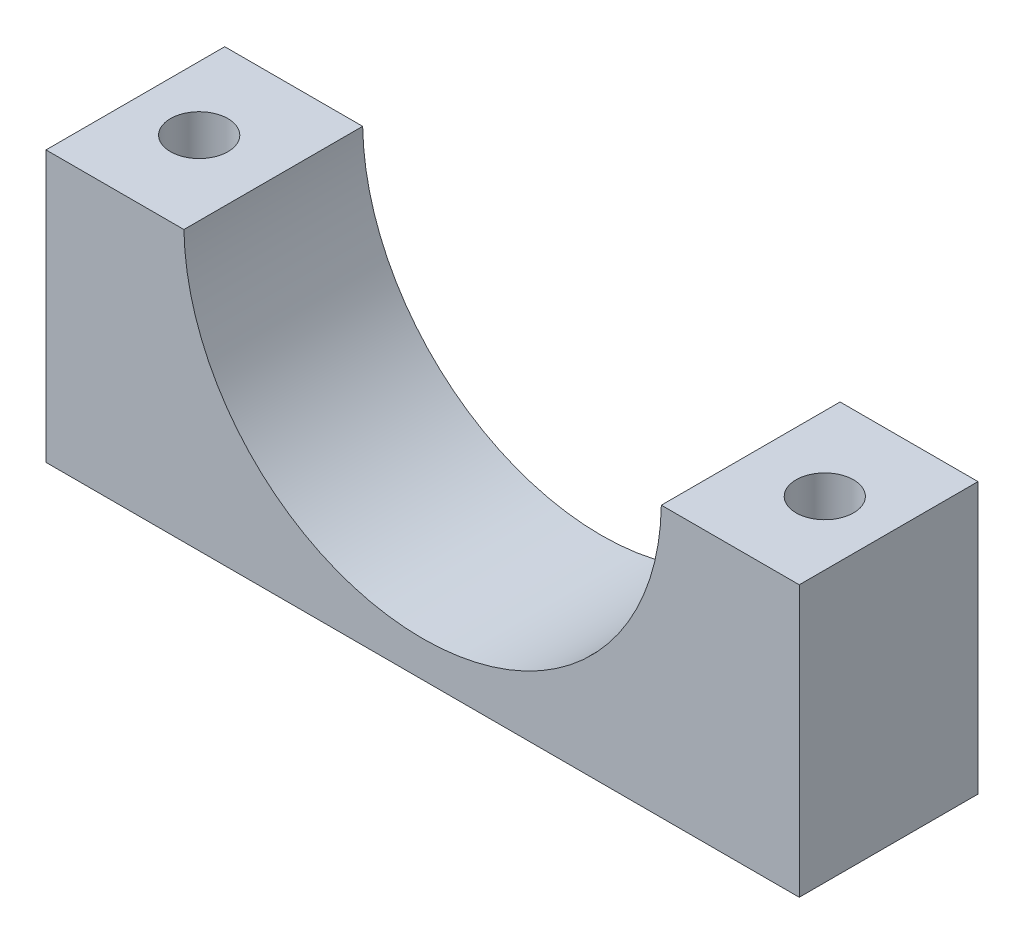
ISO-10303-21;
HEADER;
FILE_DESCRIPTION(('STEP AP214'),'2;1');
FILE_NAME('part.step','',(''),(''),'','','');
FILE_SCHEMA(('AUTOMOTIVE_DESIGN { 1 0 10303 214 1 1 1 1 }'));
ENDSEC;
DATA;
#1=APPLICATION_CONTEXT('core data for automotive mechanical design processes');
#2=APPLICATION_PROTOCOL_DEFINITION('international standard','automotive_design',2000,#1);
#3=PRODUCT_CONTEXT('',#1,'mechanical');
#4=PRODUCT('Part','Part','',(#3));
#5=PRODUCT_RELATED_PRODUCT_CATEGORY('part','',(#4));
#6=PRODUCT_DEFINITION_FORMATION('','',#4);
#7=PRODUCT_DEFINITION_CONTEXT('part definition',#1,'design');
#8=PRODUCT_DEFINITION('design','',#6,#7);
#9=PRODUCT_DEFINITION_SHAPE('','',#8);
#10=(LENGTH_UNIT() NAMED_UNIT(*) SI_UNIT(.MILLI.,.METRE.));
#11=(NAMED_UNIT(*) PLANE_ANGLE_UNIT() SI_UNIT($,.RADIAN.));
#12=(NAMED_UNIT(*) SI_UNIT($,.STERADIAN.) SOLID_ANGLE_UNIT());
#13=UNCERTAINTY_MEASURE_WITH_UNIT(LENGTH_MEASURE(1.E-05),#10,'distance_accuracy_value','');
#14=(GEOMETRIC_REPRESENTATION_CONTEXT(3) GLOBAL_UNCERTAINTY_ASSIGNED_CONTEXT((#13)) GLOBAL_UNIT_ASSIGNED_CONTEXT((#10,
#11,#12)) REPRESENTATION_CONTEXT('',''));
#15=CARTESIAN_POINT('',(0.,0.,0.));
#16=DIRECTION('',(0.,0.,1.));
#17=DIRECTION('',(1.,0.,0.));
#18=AXIS2_PLACEMENT_3D('',#15,#16,#17);
#19=CARTESIAN_POINT('',(-29.5,28.2,14.));
#20=DIRECTION('',(1.,0.,0.));
#21=DIRECTION('',(0.,0.,-1.));
#22=AXIS2_PLACEMENT_3D('',#19,#20,#21);
#23=PLANE('',#22);
#24=DIRECTION('',(0.,-1.,0.));
#25=VECTOR('',#24,1.);
#26=CARTESIAN_POINT('',(-29.5,28.2,0.));
#27=LINE('',#26,#25);
#28=CARTESIAN_POINT('',(-29.5,28.2,0.));
#29=VERTEX_POINT('',#28);
#30=CARTESIAN_POINT('',(-29.5,7.,0.));
#31=VERTEX_POINT('',#30);
#32=EDGE_CURVE('E136',#29,#31,#27,.T.);
#33=ORIENTED_EDGE('',*,*,#32,.T.);
#34=DIRECTION('',(0.,0.,-1.));
#35=VECTOR('',#34,1.);
#36=CARTESIAN_POINT('',(-29.5,7.,14.));
#37=LINE('',#36,#35);
#38=CARTESIAN_POINT('',(-29.5,7.,14.));
#39=VERTEX_POINT('',#38);
#40=EDGE_CURVE('E11',#39,#31,#37,.T.);
#41=ORIENTED_EDGE('',*,*,#40,.F.);
#42=DIRECTION('',(0.,-1.,0.));
#43=VECTOR('',#42,1.);
#44=CARTESIAN_POINT('',(-29.5,28.2,14.));
#45=LINE('',#44,#43);
#46=CARTESIAN_POINT('',(-29.5,28.2,14.));
#47=VERTEX_POINT('',#46);
#48=EDGE_CURVE('E152',#47,#39,#45,.T.);
#49=ORIENTED_EDGE('',*,*,#48,.F.);
#50=DIRECTION('',(0.,0.,-1.));
#51=VECTOR('',#50,1.);
#52=CARTESIAN_POINT('',(-29.5,28.2,14.));
#53=LINE('',#52,#51);
#54=EDGE_CURVE('E132',#47,#29,#53,.T.);
#55=ORIENTED_EDGE('',*,*,#54,.T.);
#56=EDGE_LOOP('',(#33,#41,#49,#55));
#57=FACE_BOUND('',#56,.T.);
#58=ADVANCED_FACE('F45',(#57),#23,.F.);
#59=CARTESIAN_POINT('',(-29.5,7.,14.));
#60=DIRECTION('',(0.,1.,0.));
#61=DIRECTION('',(0.,0.,1.));
#62=AXIS2_PLACEMENT_3D('',#59,#60,#61);
#63=PLANE('',#62);
#64=CARTESIAN_POINT('',(-24.5,7.,7.));
#65=DIRECTION('',(0.,1.,0.));
#66=DIRECTION('',(0.,0.,1.));
#67=AXIS2_PLACEMENT_3D('',#64,#65,#66);
#68=CIRCLE('',#67,2.25);
#69=CARTESIAN_POINT('',(-24.5,7.,9.25));
#70=VERTEX_POINT('',#69);
#71=EDGE_CURVE('E203',#70,#70,#68,.F.);
#72=ORIENTED_EDGE('',*,*,#71,.F.);
#73=EDGE_LOOP('',(#72));
#74=FACE_BOUND('',#73,.T.);
#75=CARTESIAN_POINT('',(24.5,7.,7.));
#76=DIRECTION('',(0.,1.,0.));
#77=DIRECTION('',(0.,0.,1.));
#78=AXIS2_PLACEMENT_3D('',#75,#76,#77);
#79=CIRCLE('',#78,2.25);
#80=CARTESIAN_POINT('',(24.5,7.,9.25));
#81=VERTEX_POINT('',#80);
#82=EDGE_CURVE('E141',#81,#81,#79,.F.);
#83=ORIENTED_EDGE('',*,*,#82,.F.);
#84=EDGE_LOOP('',(#83));
#85=FACE_BOUND('',#84,.T.);
#86=DIRECTION('',(1.,0.,0.));
#87=VECTOR('',#86,1.);
#88=CARTESIAN_POINT('',(-29.5,7.,0.));
#89=LINE('',#88,#87);
#90=CARTESIAN_POINT('',(29.5,7.,0.));
#91=VERTEX_POINT('',#90);
#92=EDGE_CURVE('E140',#31,#91,#89,.T.);
#93=ORIENTED_EDGE('',*,*,#92,.T.);
#94=DIRECTION('',(0.,0.,-1.));
#95=VECTOR('',#94,1.);
#96=CARTESIAN_POINT('',(29.5,7.,14.));
#97=LINE('',#96,#95);
#98=CARTESIAN_POINT('',(29.5,7.,14.));
#99=VERTEX_POINT('',#98);
#100=EDGE_CURVE('E54',#99,#91,#97,.T.);
#101=ORIENTED_EDGE('',*,*,#100,.F.);
#102=DIRECTION('',(1.,0.,0.));
#103=VECTOR('',#102,1.);
#104=CARTESIAN_POINT('',(-29.5,7.,14.));
#105=LINE('',#104,#103);
#106=EDGE_CURVE('E99',#39,#99,#105,.T.);
#107=ORIENTED_EDGE('',*,*,#106,.F.);
#108=ORIENTED_EDGE('',*,*,#40,.T.);
#109=EDGE_LOOP('',(#93,#101,#107,#108));
#110=FACE_BOUND('',#109,.T.);
#111=ADVANCED_FACE('F181',(#74,#85,#110),#63,.F.);
#112=CARTESIAN_POINT('',(29.5,7.,14.));
#113=DIRECTION('',(-1.,0.,0.));
#114=DIRECTION('',(0.,0.,1.));
#115=AXIS2_PLACEMENT_3D('',#112,#113,#114);
#116=PLANE('',#115);
#117=DIRECTION('',(0.,1.,0.));
#118=VECTOR('',#117,1.);
#119=CARTESIAN_POINT('',(29.5,7.,0.));
#120=LINE('',#119,#118);
#121=CARTESIAN_POINT('',(29.5,28.2,0.));
#122=VERTEX_POINT('',#121);
#123=EDGE_CURVE('E144',#91,#122,#120,.T.);
#124=ORIENTED_EDGE('',*,*,#123,.T.);
#125=DIRECTION('',(0.,0.,-1.));
#126=VECTOR('',#125,1.);
#127=CARTESIAN_POINT('',(29.5,28.2,14.));
#128=LINE('',#127,#126);
#129=CARTESIAN_POINT('',(29.5,28.2,14.));
#130=VERTEX_POINT('',#129);
#131=EDGE_CURVE('E123',#130,#122,#128,.T.);
#132=ORIENTED_EDGE('',*,*,#131,.F.);
#133=DIRECTION('',(0.,1.,0.));
#134=VECTOR('',#133,1.);
#135=CARTESIAN_POINT('',(29.5,7.,14.));
#136=LINE('',#135,#134);
#137=EDGE_CURVE('E112',#99,#130,#136,.T.);
#138=ORIENTED_EDGE('',*,*,#137,.F.);
#139=ORIENTED_EDGE('',*,*,#100,.T.);
#140=EDGE_LOOP('',(#124,#132,#138,#139));
#141=FACE_BOUND('',#140,.T.);
#142=ADVANCED_FACE('F162',(#141),#116,.F.);
#143=CARTESIAN_POINT('',(29.5,28.2,14.));
#144=DIRECTION('',(0.,-1.,0.));
#145=DIRECTION('',(0.,0.,-1.));
#146=AXIS2_PLACEMENT_3D('',#143,#144,#145);
#147=PLANE('',#146);
#148=CARTESIAN_POINT('',(24.5,28.2,7.));
#149=DIRECTION('',(0.,1.,0.));
#150=DIRECTION('',(0.,0.,1.));
#151=AXIS2_PLACEMENT_3D('',#148,#149,#150);
#152=CIRCLE('',#151,2.25);
#153=CARTESIAN_POINT('',(24.5,28.2,9.25));
#154=VERTEX_POINT('',#153);
#155=EDGE_CURVE('E196',#154,#154,#152,.T.);
#156=ORIENTED_EDGE('',*,*,#155,.F.);
#157=EDGE_LOOP('',(#156));
#158=FACE_BOUND('',#157,.T.);
#159=DIRECTION('',(-1.,0.,0.));
#160=VECTOR('',#159,1.);
#161=CARTESIAN_POINT('',(29.5,28.2,0.));
#162=LINE('',#161,#160);
#163=CARTESIAN_POINT('',(18.697593428,28.2,0.));
#164=VERTEX_POINT('',#163);
#165=EDGE_CURVE('E121',#122,#164,#162,.T.);
#166=ORIENTED_EDGE('',*,*,#165,.T.);
#167=DIRECTION('',(0.,0.,-1.));
#168=VECTOR('',#167,1.);
#169=CARTESIAN_POINT('',(18.697593428,28.2,14.));
#170=LINE('',#169,#168);
#171=CARTESIAN_POINT('',(18.697593428,28.2,14.));
#172=VERTEX_POINT('',#171);
#173=EDGE_CURVE('E118',#172,#164,#170,.T.);
#174=ORIENTED_EDGE('',*,*,#173,.F.);
#175=DIRECTION('',(-1.,0.,0.));
#176=VECTOR('',#175,1.);
#177=CARTESIAN_POINT('',(29.5,28.2,14.));
#178=LINE('',#177,#176);
#179=EDGE_CURVE('E106',#130,#172,#178,.T.);
#180=ORIENTED_EDGE('',*,*,#179,.F.);
#181=ORIENTED_EDGE('',*,*,#131,.T.);
#182=EDGE_LOOP('',(#166,#174,#180,#181));
#183=FACE_BOUND('',#182,.T.);
#184=ADVANCED_FACE('F119',(#158,#183),#147,.F.);
#185=CARTESIAN_POINT('',(0.,28.4999999999671,14.));
#186=DIRECTION('',(0.,0.,-1.));
#187=DIRECTION('',(-1.,0.,0.));
#188=AXIS2_PLACEMENT_3D('',#185,#186,#187);
#189=CYLINDRICAL_SURFACE('',#188,18.6999999999671);
#190=CARTESIAN_POINT('',(0.,28.4999999999671,0.));
#191=DIRECTION('',(0.,0.,-1.));
#192=DIRECTION('',(-1.,0.,0.));
#193=AXIS2_PLACEMENT_3D('',#190,#191,#192);
#194=CIRCLE('',#193,18.6999999999671);
#195=CARTESIAN_POINT('',(-18.697593428,28.2,0.));
#196=VERTEX_POINT('',#195);
#197=EDGE_CURVE('E85',#164,#196,#194,.T.);
#198=ORIENTED_EDGE('',*,*,#197,.T.);
#199=DIRECTION('',(0.,0.,-1.));
#200=VECTOR('',#199,1.);
#201=CARTESIAN_POINT('',(-18.697593428,28.2,14.));
#202=LINE('',#201,#200);
#203=CARTESIAN_POINT('',(-18.697593428,28.2,14.));
#204=VERTEX_POINT('',#203);
#205=EDGE_CURVE('E124',#204,#196,#202,.T.);
#206=ORIENTED_EDGE('',*,*,#205,.F.);
#207=CARTESIAN_POINT('',(0.,28.4999999999671,14.));
#208=DIRECTION('',(0.,0.,-1.));
#209=DIRECTION('',(-1.,0.,0.));
#210=AXIS2_PLACEMENT_3D('',#207,#208,#209);
#211=CIRCLE('',#210,18.6999999999671);
#212=EDGE_CURVE('E110',#172,#204,#211,.T.);
#213=ORIENTED_EDGE('',*,*,#212,.F.);
#214=ORIENTED_EDGE('',*,*,#173,.T.);
#215=EDGE_LOOP('',(#198,#206,#213,#214));
#216=FACE_BOUND('',#215,.T.);
#217=ADVANCED_FACE('F126',(#216),#189,.F.);
#218=CARTESIAN_POINT('',(-18.697593428,28.2,14.));
#219=DIRECTION('',(0.,-1.,0.));
#220=DIRECTION('',(0.,0.,-1.));
#221=AXIS2_PLACEMENT_3D('',#218,#219,#220);
#222=PLANE('',#221);
#223=CARTESIAN_POINT('',(-24.5,28.2,7.));
#224=DIRECTION('',(0.,1.,0.));
#225=DIRECTION('',(0.,0.,1.));
#226=AXIS2_PLACEMENT_3D('',#223,#224,#225);
#227=CIRCLE('',#226,2.25);
#228=CARTESIAN_POINT('',(-24.5,28.2,9.25));
#229=VERTEX_POINT('',#228);
#230=EDGE_CURVE('E199',#229,#229,#227,.T.);
#231=ORIENTED_EDGE('',*,*,#230,.F.);
#232=EDGE_LOOP('',(#231));
#233=FACE_BOUND('',#232,.T.);
#234=DIRECTION('',(-1.,0.,0.));
#235=VECTOR('',#234,1.);
#236=CARTESIAN_POINT('',(-18.697593428,28.2,0.));
#237=LINE('',#236,#235);
#238=EDGE_CURVE('E91',#196,#29,#237,.T.);
#239=ORIENTED_EDGE('',*,*,#238,.T.);
#240=ORIENTED_EDGE('',*,*,#54,.F.);
#241=DIRECTION('',(-1.,0.,0.));
#242=VECTOR('',#241,1.);
#243=CARTESIAN_POINT('',(-18.697593428,28.2,14.));
#244=LINE('',#243,#242);
#245=EDGE_CURVE('E62',#204,#47,#244,.T.);
#246=ORIENTED_EDGE('',*,*,#245,.F.);
#247=ORIENTED_EDGE('',*,*,#205,.T.);
#248=EDGE_LOOP('',(#239,#240,#246,#247));
#249=FACE_BOUND('',#248,.T.);
#250=ADVANCED_FACE('F169',(#233,#249),#222,.F.);
#251=CARTESIAN_POINT('',(0.,28.4999999999671,14.));
#252=DIRECTION('',(0.,0.,-1.));
#253=DIRECTION('',(-1.,0.,0.));
#254=AXIS2_PLACEMENT_3D('',#251,#252,#253);
#255=PLANE('',#254);
#256=ORIENTED_EDGE('',*,*,#48,.T.);
#257=ORIENTED_EDGE('',*,*,#106,.T.);
#258=ORIENTED_EDGE('',*,*,#137,.T.);
#259=ORIENTED_EDGE('',*,*,#179,.T.);
#260=ORIENTED_EDGE('',*,*,#212,.T.);
#261=ORIENTED_EDGE('',*,*,#245,.T.);
#262=EDGE_LOOP('',(#256,#257,#258,#259,#260,#261));
#263=FACE_BOUND('',#262,.T.);
#264=ADVANCED_FACE('F108',(#263),#255,.F.);
#265=CARTESIAN_POINT('',(0.,28.4999999999671,0.));
#266=DIRECTION('',(0.,0.,-1.));
#267=DIRECTION('',(-1.,0.,0.));
#268=AXIS2_PLACEMENT_3D('',#265,#266,#267);
#269=PLANE('',#268);
#270=ORIENTED_EDGE('',*,*,#32,.F.);
#271=ORIENTED_EDGE('',*,*,#238,.F.);
#272=ORIENTED_EDGE('',*,*,#197,.F.);
#273=ORIENTED_EDGE('',*,*,#165,.F.);
#274=ORIENTED_EDGE('',*,*,#123,.F.);
#275=ORIENTED_EDGE('',*,*,#92,.F.);
#276=EDGE_LOOP('',(#270,#271,#272,#273,#274,#275));
#277=FACE_BOUND('',#276,.T.);
#278=ADVANCED_FACE('F165',(#277),#269,.T.);
#279=CARTESIAN_POINT('',(-24.5,7.,7.));
#280=DIRECTION('',(0.,-1.,0.));
#281=DIRECTION('',(0.,0.,-1.));
#282=AXIS2_PLACEMENT_3D('',#279,#280,#281);
#283=CYLINDRICAL_SURFACE('',#282,2.25);
#284=ORIENTED_EDGE('',*,*,#230,.T.);
#285=EDGE_LOOP('',(#284));
#286=FACE_BOUND('',#285,.T.);
#287=ORIENTED_EDGE('',*,*,#71,.T.);
#288=EDGE_LOOP('',(#287));
#289=FACE_BOUND('',#288,.T.);
#290=ADVANCED_FACE('F219',(#286,#289),#283,.F.);
#291=CARTESIAN_POINT('',(24.5,7.,7.));
#292=DIRECTION('',(0.,-1.,0.));
#293=DIRECTION('',(0.,0.,-1.));
#294=AXIS2_PLACEMENT_3D('',#291,#292,#293);
#295=CYLINDRICAL_SURFACE('',#294,2.25);
#296=ORIENTED_EDGE('',*,*,#155,.T.);
#297=EDGE_LOOP('',(#296));
#298=FACE_BOUND('',#297,.T.);
#299=ORIENTED_EDGE('',*,*,#82,.T.);
#300=EDGE_LOOP('',(#299));
#301=FACE_BOUND('',#300,.T.);
#302=ADVANCED_FACE('F217',(#298,#301),#295,.F.);
#303=CLOSED_SHELL('',(#58,#111,#142,#184,#217,#250,#264,#278,#290,#302));
#304=MANIFOLD_SOLID_BREP('B2',#303);
#305=ADVANCED_BREP_SHAPE_REPRESENTATION('',(#18,#304),#14);
#306=SHAPE_DEFINITION_REPRESENTATION(#9,#305);
ENDSEC;
END-ISO-10303-21;
